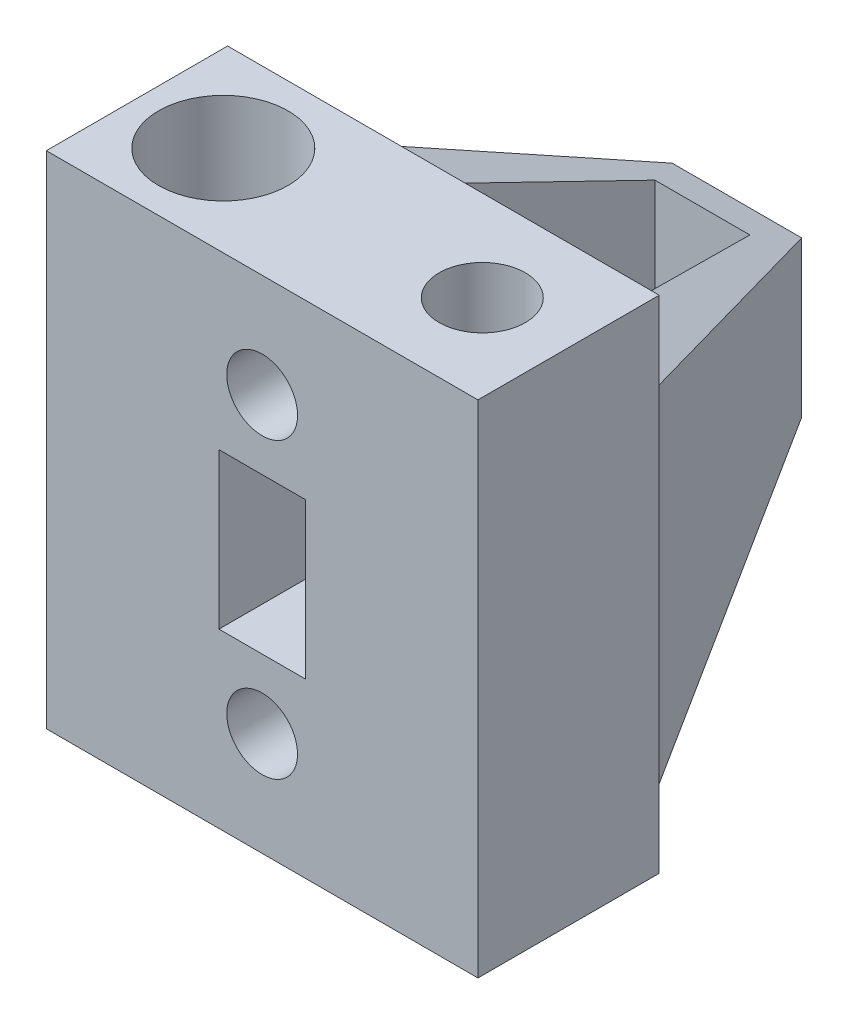
ISO-10303-21;
HEADER;
FILE_DESCRIPTION(('STEP AP214'),'2;1');
FILE_NAME('part.step','',(''),(''),'','','');
FILE_SCHEMA(('AUTOMOTIVE_DESIGN { 1 0 10303 214 1 1 1 1 }'));
ENDSEC;
DATA;
#1=APPLICATION_CONTEXT('core data for automotive mechanical design processes');
#2=APPLICATION_PROTOCOL_DEFINITION('international standard','automotive_design',2000,#1);
#3=PRODUCT_CONTEXT('',#1,'mechanical');
#4=PRODUCT('Part','Part','',(#3));
#5=PRODUCT_RELATED_PRODUCT_CATEGORY('part','',(#4));
#6=PRODUCT_DEFINITION_FORMATION('','',#4);
#7=PRODUCT_DEFINITION_CONTEXT('part definition',#1,'design');
#8=PRODUCT_DEFINITION('design','',#6,#7);
#9=PRODUCT_DEFINITION_SHAPE('','',#8);
#10=(LENGTH_UNIT() NAMED_UNIT(*) SI_UNIT(.MILLI.,.METRE.));
#11=(NAMED_UNIT(*) PLANE_ANGLE_UNIT() SI_UNIT($,.RADIAN.));
#12=(NAMED_UNIT(*) SI_UNIT($,.STERADIAN.) SOLID_ANGLE_UNIT());
#13=UNCERTAINTY_MEASURE_WITH_UNIT(LENGTH_MEASURE(1.E-05),#10,'distance_accuracy_value','');
#14=(GEOMETRIC_REPRESENTATION_CONTEXT(3) GLOBAL_UNCERTAINTY_ASSIGNED_CONTEXT((#13)) GLOBAL_UNIT_ASSIGNED_CONTEXT((#10,
#11,#12)) REPRESENTATION_CONTEXT('',''));
#15=CARTESIAN_POINT('',(0.,0.,0.));
#16=DIRECTION('',(0.,0.,1.));
#17=DIRECTION('',(1.,0.,0.));
#18=AXIS2_PLACEMENT_3D('',#15,#16,#17);
#19=CARTESIAN_POINT('',(25.,58.,-10.5));
#20=DIRECTION('',(-1.,0.,0.));
#21=DIRECTION('',(0.,0.,1.));
#22=AXIS2_PLACEMENT_3D('',#19,#20,#21);
#23=PLANE('',#22);
#24=DIRECTION('',(0.,0.,-1.));
#25=VECTOR('',#24,1.);
#26=CARTESIAN_POINT('',(25.,0.,-10.5));
#27=LINE('',#26,#25);
#28=CARTESIAN_POINT('',(25.,0.,10.5));
#29=VERTEX_POINT('',#28);
#30=CARTESIAN_POINT('',(25.,0.,-10.5));
#31=VERTEX_POINT('',#30);
#32=EDGE_CURVE('E231',#29,#31,#27,.T.);
#33=ORIENTED_EDGE('',*,*,#32,.T.);
#34=DIRECTION('',(0.,-1.,0.));
#35=VECTOR('',#34,1.);
#36=CARTESIAN_POINT('',(25.,58.,-10.5));
#37=LINE('',#36,#35);
#38=CARTESIAN_POINT('',(25.,9.00000000000001,-10.5));
#39=VERTEX_POINT('',#38);
#40=EDGE_CURVE('E40',#39,#31,#37,.T.);
#41=ORIENTED_EDGE('',*,*,#40,.F.);
#42=DIRECTION('',(0.,-1.,0.));
#43=VECTOR('',#42,1.);
#44=CARTESIAN_POINT('',(25.,49.,-10.5));
#45=LINE('',#44,#43);
#46=CARTESIAN_POINT('',(25.,49.,-10.5));
#47=VERTEX_POINT('',#46);
#48=EDGE_CURVE('E164',#47,#39,#45,.T.);
#49=ORIENTED_EDGE('',*,*,#48,.F.);
#50=CARTESIAN_POINT('',(25.,58.,-10.5));
#51=VERTEX_POINT('',#50);
#52=EDGE_CURVE('E11',#51,#47,#37,.T.);
#53=ORIENTED_EDGE('',*,*,#52,.F.);
#54=DIRECTION('',(0.,0.,-1.));
#55=VECTOR('',#54,1.);
#56=CARTESIAN_POINT('',(25.,58.,-10.5));
#57=LINE('',#56,#55);
#58=CARTESIAN_POINT('',(25.,58.,10.5));
#59=VERTEX_POINT('',#58);
#60=EDGE_CURVE('E234',#59,#51,#57,.T.);
#61=ORIENTED_EDGE('',*,*,#60,.F.);
#62=DIRECTION('',(0.,-1.,0.));
#63=VECTOR('',#62,1.);
#64=CARTESIAN_POINT('',(25.,58.,10.5));
#65=LINE('',#64,#63);
#66=EDGE_CURVE('E244',#59,#29,#65,.T.);
#67=ORIENTED_EDGE('',*,*,#66,.T.);
#68=EDGE_LOOP('',(#33,#41,#49,#53,#61,#67));
#69=FACE_BOUND('',#68,.T.);
#70=ADVANCED_FACE('F33',(#69),#23,.F.);
#71=CARTESIAN_POINT('',(-25.,58.,-10.5));
#72=DIRECTION('',(0.,0.,1.));
#73=DIRECTION('',(1.,0.,0.));
#74=AXIS2_PLACEMENT_3D('',#71,#72,#73);
#75=PLANE('',#74);
#76=DIRECTION('',(-1.,0.,0.));
#77=VECTOR('',#76,1.);
#78=CARTESIAN_POINT('',(-5.,20.,-10.5));
#79=LINE('',#78,#77);
#80=CARTESIAN_POINT('',(5.,20.,-10.5));
#81=VERTEX_POINT('',#80);
#82=CARTESIAN_POINT('',(-5.,20.,-10.5));
#83=VERTEX_POINT('',#82);
#84=EDGE_CURVE('E180',#81,#83,#79,.T.);
#85=ORIENTED_EDGE('',*,*,#84,.F.);
#86=DIRECTION('',(0.,-1.,0.));
#87=VECTOR('',#86,1.);
#88=CARTESIAN_POINT('',(5.,20.,-10.5));
#89=LINE('',#88,#87);
#90=CARTESIAN_POINT('',(5.,38.,-10.5));
#91=VERTEX_POINT('',#90);
#92=EDGE_CURVE('E183',#91,#81,#89,.T.);
#93=ORIENTED_EDGE('',*,*,#92,.F.);
#94=DIRECTION('',(1.,0.,0.));
#95=VECTOR('',#94,1.);
#96=CARTESIAN_POINT('',(-5.,38.,-10.5));
#97=LINE('',#96,#95);
#98=CARTESIAN_POINT('',(-5.,38.,-10.5));
#99=VERTEX_POINT('',#98);
#100=EDGE_CURVE('E200',#99,#91,#97,.T.);
#101=ORIENTED_EDGE('',*,*,#100,.F.);
#102=DIRECTION('',(0.,1.,0.));
#103=VECTOR('',#102,1.);
#104=CARTESIAN_POINT('',(-5.,20.,-10.5));
#105=LINE('',#104,#103);
#106=EDGE_CURVE('E178',#83,#99,#105,.T.);
#107=ORIENTED_EDGE('',*,*,#106,.F.);
#108=EDGE_LOOP('',(#85,#93,#101,#107));
#109=FACE_BOUND('',#108,.T.);
#110=DIRECTION('',(0.,-1.,0.));
#111=VECTOR('',#110,1.);
#112=CARTESIAN_POINT('',(15.,49.,-10.5));
#113=LINE('',#112,#111);
#114=CARTESIAN_POINT('',(15.,49.,-10.5));
#115=VERTEX_POINT('',#114);
#116=CARTESIAN_POINT('',(15.,9.00000000000001,-10.5));
#117=VERTEX_POINT('',#116);
#118=EDGE_CURVE('E157',#115,#117,#113,.T.);
#119=ORIENTED_EDGE('',*,*,#118,.T.);
#120=DIRECTION('',(1.,0.,0.));
#121=VECTOR('',#120,1.);
#122=CARTESIAN_POINT('',(25.,9.00000000000001,-10.5));
#123=LINE('',#122,#121);
#124=EDGE_CURVE('E142',#117,#39,#123,.T.);
#125=ORIENTED_EDGE('',*,*,#124,.T.);
#126=ORIENTED_EDGE('',*,*,#40,.T.);
#127=DIRECTION('',(-1.,0.,0.));
#128=VECTOR('',#127,1.);
#129=CARTESIAN_POINT('',(-25.,0.,-10.5));
#130=LINE('',#129,#128);
#131=CARTESIAN_POINT('',(-25.,0.,-10.5));
#132=VERTEX_POINT('',#131);
#133=EDGE_CURVE('E247',#31,#132,#130,.T.);
#134=ORIENTED_EDGE('',*,*,#133,.T.);
#135=DIRECTION('',(0.,-1.,0.));
#136=VECTOR('',#135,1.);
#137=CARTESIAN_POINT('',(-25.,58.,-10.5));
#138=LINE('',#137,#136);
#139=CARTESIAN_POINT('',(-25.,9.00000000000001,-10.5));
#140=VERTEX_POINT('',#139);
#141=EDGE_CURVE('E257',#140,#132,#138,.T.);
#142=ORIENTED_EDGE('',*,*,#141,.F.);
#143=DIRECTION('',(1.,0.,0.));
#144=VECTOR('',#143,1.);
#145=CARTESIAN_POINT('',(-25.,9.00000000000001,-10.5));
#146=LINE('',#145,#144);
#147=CARTESIAN_POINT('',(-15.,9.00000000000001,-10.5));
#148=VERTEX_POINT('',#147);
#149=EDGE_CURVE('E151',#140,#148,#146,.T.);
#150=ORIENTED_EDGE('',*,*,#149,.T.);
#151=DIRECTION('',(0.,-1.,0.));
#152=VECTOR('',#151,1.);
#153=CARTESIAN_POINT('',(-15.,49.,-10.5));
#154=LINE('',#153,#152);
#155=CARTESIAN_POINT('',(-15.,49.,-10.5));
#156=VERTEX_POINT('',#155);
#157=EDGE_CURVE('E175',#156,#148,#154,.T.);
#158=ORIENTED_EDGE('',*,*,#157,.F.);
#159=DIRECTION('',(1.,0.,0.));
#160=VECTOR('',#159,1.);
#161=CARTESIAN_POINT('',(-25.,49.,-10.5));
#162=LINE('',#161,#160);
#163=CARTESIAN_POINT('',(-25.,49.,-10.5));
#164=VERTEX_POINT('',#163);
#165=EDGE_CURVE('E150',#164,#156,#162,.T.);
#166=ORIENTED_EDGE('',*,*,#165,.F.);
#167=CARTESIAN_POINT('',(-25.,58.,-10.5));
#168=VERTEX_POINT('',#167);
#169=EDGE_CURVE('E258',#168,#164,#138,.T.);
#170=ORIENTED_EDGE('',*,*,#169,.F.);
#171=DIRECTION('',(-1.,0.,0.));
#172=VECTOR('',#171,1.);
#173=CARTESIAN_POINT('',(-25.,58.,-10.5));
#174=LINE('',#173,#172);
#175=EDGE_CURVE('E237',#51,#168,#174,.T.);
#176=ORIENTED_EDGE('',*,*,#175,.F.);
#177=ORIENTED_EDGE('',*,*,#52,.T.);
#178=DIRECTION('',(1.,0.,0.));
#179=VECTOR('',#178,1.);
#180=CARTESIAN_POINT('',(25.,49.,-10.5));
#181=LINE('',#180,#179);
#182=EDGE_CURVE('E163',#115,#47,#181,.T.);
#183=ORIENTED_EDGE('',*,*,#182,.F.);
#184=EDGE_LOOP('',(#119,#125,#126,#134,#142,#150,#158,#166,#170,#176,#177,#183));
#185=FACE_BOUND('',#184,.T.);
#186=ADVANCED_FACE('F162',(#109,#185),#75,.F.);
#187=CARTESIAN_POINT('',(-25.,58.,-10.5));
#188=DIRECTION('',(1.,0.,0.));
#189=DIRECTION('',(0.,0.,-1.));
#190=AXIS2_PLACEMENT_3D('',#187,#188,#189);
#191=PLANE('',#190);
#192=DIRECTION('',(0.,0.,1.));
#193=VECTOR('',#192,1.);
#194=CARTESIAN_POINT('',(-25.,0.,-10.5));
#195=LINE('',#194,#193);
#196=CARTESIAN_POINT('',(-25.,0.,10.5));
#197=VERTEX_POINT('',#196);
#198=EDGE_CURVE('E250',#132,#197,#195,.T.);
#199=ORIENTED_EDGE('',*,*,#198,.T.);
#200=DIRECTION('',(0.,-1.,0.));
#201=VECTOR('',#200,1.);
#202=CARTESIAN_POINT('',(-25.,58.,10.5));
#203=LINE('',#202,#201);
#204=CARTESIAN_POINT('',(-25.,58.,10.5));
#205=VERTEX_POINT('',#204);
#206=EDGE_CURVE('E255',#205,#197,#203,.T.);
#207=ORIENTED_EDGE('',*,*,#206,.F.);
#208=DIRECTION('',(0.,0.,1.));
#209=VECTOR('',#208,1.);
#210=CARTESIAN_POINT('',(-25.,58.,-10.5));
#211=LINE('',#210,#209);
#212=EDGE_CURVE('E240',#168,#205,#211,.T.);
#213=ORIENTED_EDGE('',*,*,#212,.F.);
#214=ORIENTED_EDGE('',*,*,#169,.T.);
#215=DIRECTION('',(0.,-1.,0.));
#216=VECTOR('',#215,1.);
#217=CARTESIAN_POINT('',(-25.,49.,-10.5));
#218=LINE('',#217,#216);
#219=EDGE_CURVE('E269',#164,#140,#218,.T.);
#220=ORIENTED_EDGE('',*,*,#219,.T.);
#221=ORIENTED_EDGE('',*,*,#141,.T.);
#222=EDGE_LOOP('',(#199,#207,#213,#214,#220,#221));
#223=FACE_BOUND('',#222,.T.);
#224=ADVANCED_FACE('F265',(#223),#191,.F.);
#225=CARTESIAN_POINT('',(-25.,58.,10.5));
#226=DIRECTION('',(0.,0.,-1.));
#227=DIRECTION('',(-1.,0.,0.));
#228=AXIS2_PLACEMENT_3D('',#225,#226,#227);
#229=PLANE('',#228);
#230=CARTESIAN_POINT('',(0.,46.,10.5));
#231=DIRECTION('',(0.,0.,1.));
#232=DIRECTION('',(1.,0.,0.));
#233=AXIS2_PLACEMENT_3D('',#230,#231,#232);
#234=CIRCLE('',#233,4.1);
#235=CARTESIAN_POINT('',(4.1,46.,10.5));
#236=VERTEX_POINT('',#235);
#237=EDGE_CURVE('E351',#236,#236,#234,.T.);
#238=ORIENTED_EDGE('',*,*,#237,.F.);
#239=EDGE_LOOP('',(#238));
#240=FACE_BOUND('',#239,.T.);
#241=CARTESIAN_POINT('',(0.,12.,10.5));
#242=DIRECTION('',(0.,0.,1.));
#243=DIRECTION('',(-1.,0.,0.));
#244=AXIS2_PLACEMENT_3D('',#241,#242,#243);
#245=CIRCLE('',#244,4.1);
#246=CARTESIAN_POINT('',(-4.1,12.,10.5));
#247=VERTEX_POINT('',#246);
#248=EDGE_CURVE('E345',#247,#247,#245,.T.);
#249=ORIENTED_EDGE('',*,*,#248,.F.);
#250=EDGE_LOOP('',(#249));
#251=FACE_BOUND('',#250,.T.);
#252=DIRECTION('',(-1.,0.,0.));
#253=VECTOR('',#252,1.);
#254=CARTESIAN_POINT('',(-5.,38.,10.5));
#255=LINE('',#254,#253);
#256=CARTESIAN_POINT('',(5.,38.,10.5));
#257=VERTEX_POINT('',#256);
#258=CARTESIAN_POINT('',(-5.,38.,10.5));
#259=VERTEX_POINT('',#258);
#260=EDGE_CURVE('E188',#257,#259,#255,.T.);
#261=ORIENTED_EDGE('',*,*,#260,.F.);
#262=DIRECTION('',(0.,1.,0.));
#263=VECTOR('',#262,1.);
#264=CARTESIAN_POINT('',(5.,20.,10.5));
#265=LINE('',#264,#263);
#266=CARTESIAN_POINT('',(5.,20.,10.5));
#267=VERTEX_POINT('',#266);
#268=EDGE_CURVE('E186',#267,#257,#265,.T.);
#269=ORIENTED_EDGE('',*,*,#268,.F.);
#270=DIRECTION('',(1.,0.,0.));
#271=VECTOR('',#270,1.);
#272=CARTESIAN_POINT('',(-5.,20.,10.5));
#273=LINE('',#272,#271);
#274=CARTESIAN_POINT('',(-5.,20.,10.5));
#275=VERTEX_POINT('',#274);
#276=EDGE_CURVE('E194',#275,#267,#273,.T.);
#277=ORIENTED_EDGE('',*,*,#276,.F.);
#278=DIRECTION('',(0.,-1.,0.));
#279=VECTOR('',#278,1.);
#280=CARTESIAN_POINT('',(-5.,20.,10.5));
#281=LINE('',#280,#279);
#282=EDGE_CURVE('E191',#259,#275,#281,.T.);
#283=ORIENTED_EDGE('',*,*,#282,.F.);
#284=EDGE_LOOP('',(#261,#269,#277,#283));
#285=FACE_BOUND('',#284,.T.);
#286=DIRECTION('',(1.,0.,0.));
#287=VECTOR('',#286,1.);
#288=CARTESIAN_POINT('',(-25.,0.,10.5));
#289=LINE('',#288,#287);
#290=EDGE_CURVE('E238',#197,#29,#289,.T.);
#291=ORIENTED_EDGE('',*,*,#290,.T.);
#292=ORIENTED_EDGE('',*,*,#66,.F.);
#293=DIRECTION('',(1.,0.,0.));
#294=VECTOR('',#293,1.);
#295=CARTESIAN_POINT('',(-25.,58.,10.5));
#296=LINE('',#295,#294);
#297=EDGE_CURVE('E242',#205,#59,#296,.T.);
#298=ORIENTED_EDGE('',*,*,#297,.F.);
#299=ORIENTED_EDGE('',*,*,#206,.T.);
#300=EDGE_LOOP('',(#291,#292,#298,#299));
#301=FACE_BOUND('',#300,.T.);
#302=ADVANCED_FACE('F278',(#240,#251,#285,#301),#229,.F.);
#303=CARTESIAN_POINT('',(0.,58.,0.));
#304=DIRECTION('',(0.,1.,0.));
#305=DIRECTION('',(0.,0.,1.));
#306=AXIS2_PLACEMENT_3D('',#303,#304,#305);
#307=PLANE('',#306);
#308=CARTESIAN_POINT('',(15.,58.,0.));
#309=DIRECTION('',(0.,1.,0.));
#310=DIRECTION('',(0.,0.,1.));
#311=AXIS2_PLACEMENT_3D('',#308,#309,#310);
#312=CIRCLE('',#311,5.);
#313=CARTESIAN_POINT('',(15.,58.,5.));
#314=VERTEX_POINT('',#313);
#315=EDGE_CURVE('E219',#314,#314,#312,.T.);
#316=ORIENTED_EDGE('',*,*,#315,.F.);
#317=EDGE_LOOP('',(#316));
#318=FACE_BOUND('',#317,.T.);
#319=CARTESIAN_POINT('',(-15.,58.,0.));
#320=DIRECTION('',(0.,1.,0.));
#321=DIRECTION('',(0.,0.,1.));
#322=AXIS2_PLACEMENT_3D('',#319,#320,#321);
#323=CIRCLE('',#322,7.5);
#324=CARTESIAN_POINT('',(-15.,58.,7.5));
#325=VERTEX_POINT('',#324);
#326=EDGE_CURVE('E227',#325,#325,#323,.T.);
#327=ORIENTED_EDGE('',*,*,#326,.F.);
#328=EDGE_LOOP('',(#327));
#329=FACE_BOUND('',#328,.T.);
#330=ORIENTED_EDGE('',*,*,#60,.T.);
#331=ORIENTED_EDGE('',*,*,#175,.T.);
#332=ORIENTED_EDGE('',*,*,#212,.T.);
#333=ORIENTED_EDGE('',*,*,#297,.T.);
#334=EDGE_LOOP('',(#330,#331,#332,#333));
#335=FACE_BOUND('',#334,.T.);
#336=ADVANCED_FACE('F285',(#318,#329,#335),#307,.T.);
#337=CARTESIAN_POINT('',(0.,0.,0.));
#338=DIRECTION('',(0.,1.,0.));
#339=DIRECTION('',(0.,0.,1.));
#340=AXIS2_PLACEMENT_3D('',#337,#338,#339);
#341=PLANE('',#340);
#342=CARTESIAN_POINT('',(-15.,0.,0.));
#343=DIRECTION('',(0.,-1.,0.));
#344=DIRECTION('',(0.,0.,-1.));
#345=AXIS2_PLACEMENT_3D('',#342,#343,#344);
#346=CIRCLE('',#345,7.5);
#347=CARTESIAN_POINT('',(-15.,0.,-7.5));
#348=VERTEX_POINT('',#347);
#349=EDGE_CURVE('E215',#348,#348,#346,.T.);
#350=ORIENTED_EDGE('',*,*,#349,.F.);
#351=EDGE_LOOP('',(#350));
#352=FACE_BOUND('',#351,.T.);
#353=CARTESIAN_POINT('',(15.,0.,0.));
#354=DIRECTION('',(0.,1.,0.));
#355=DIRECTION('',(0.,0.,1.));
#356=AXIS2_PLACEMENT_3D('',#353,#354,#355);
#357=CIRCLE('',#356,5.);
#358=CARTESIAN_POINT('',(15.,0.,5.));
#359=VERTEX_POINT('',#358);
#360=EDGE_CURVE('E224',#359,#359,#357,.F.);
#361=ORIENTED_EDGE('',*,*,#360,.F.);
#362=EDGE_LOOP('',(#361));
#363=FACE_BOUND('',#362,.T.);
#364=ORIENTED_EDGE('',*,*,#32,.F.);
#365=ORIENTED_EDGE('',*,*,#290,.F.);
#366=ORIENTED_EDGE('',*,*,#198,.F.);
#367=ORIENTED_EDGE('',*,*,#133,.F.);
#368=EDGE_LOOP('',(#364,#365,#366,#367));
#369=FACE_BOUND('',#368,.T.);
#370=ADVANCED_FACE('F275',(#352,#363,#369),#341,.F.);
#371=CARTESIAN_POINT('',(-15.,34.,0.));
#372=DIRECTION('',(0.,1.,0.));
#373=DIRECTION('',(0.,0.,1.));
#374=AXIS2_PLACEMENT_3D('',#371,#372,#373);
#375=CYLINDRICAL_SURFACE('',#374,7.5);
#376=CARTESIAN_POINT('',(-15.,34.,0.));
#377=DIRECTION('',(0.,1.,0.));
#378=DIRECTION('',(0.,0.,1.));
#379=AXIS2_PLACEMENT_3D('',#376,#377,#378);
#380=CIRCLE('',#379,7.5);
#381=CARTESIAN_POINT('',(-15.,34.,7.5));
#382=VERTEX_POINT('',#381);
#383=EDGE_CURVE('E228',#382,#382,#380,.T.);
#384=ORIENTED_EDGE('',*,*,#383,.F.);
#385=EDGE_LOOP('',(#384));
#386=FACE_BOUND('',#385,.T.);
#387=ORIENTED_EDGE('',*,*,#326,.T.);
#388=EDGE_LOOP('',(#387));
#389=FACE_BOUND('',#388,.T.);
#390=ADVANCED_FACE('F398',(#386,#389),#375,.F.);
#391=CARTESIAN_POINT('',(-15.,34.,0.));
#392=DIRECTION('',(0.,1.,0.));
#393=DIRECTION('',(0.,0.,1.));
#394=AXIS2_PLACEMENT_3D('',#391,#392,#393);
#395=PLANE('',#394);
#396=CARTESIAN_POINT('',(-15.,34.,0.));
#397=DIRECTION('',(0.,1.,0.));
#398=DIRECTION('',(0.,0.,1.));
#399=AXIS2_PLACEMENT_3D('',#396,#397,#398);
#400=CIRCLE('',#399,4.5);
#401=CARTESIAN_POINT('',(-15.,34.,4.5));
#402=VERTEX_POINT('',#401);
#403=EDGE_CURVE('E212',#402,#402,#400,.F.);
#404=ORIENTED_EDGE('',*,*,#403,.T.);
#405=EDGE_LOOP('',(#404));
#406=FACE_BOUND('',#405,.T.);
#407=ORIENTED_EDGE('',*,*,#383,.T.);
#408=EDGE_LOOP('',(#407));
#409=FACE_BOUND('',#408,.T.);
#410=ADVANCED_FACE('F405',(#406,#409),#395,.T.);
#411=CARTESIAN_POINT('',(15.,-0.001000000000001,0.));
#412=DIRECTION('',(0.,1.,0.));
#413=DIRECTION('',(0.,0.,1.));
#414=AXIS2_PLACEMENT_3D('',#411,#412,#413);
#415=CYLINDRICAL_SURFACE('',#414,5.);
#416=ORIENTED_EDGE('',*,*,#315,.T.);
#417=EDGE_LOOP('',(#416));
#418=FACE_BOUND('',#417,.T.);
#419=ORIENTED_EDGE('',*,*,#360,.T.);
#420=EDGE_LOOP('',(#419));
#421=FACE_BOUND('',#420,.T.);
#422=ADVANCED_FACE('F409',(#418,#421),#415,.F.);
#423=CARTESIAN_POINT('',(-15.,24.,0.));
#424=DIRECTION('',(0.,-1.,0.));
#425=DIRECTION('',(0.,0.,-1.));
#426=AXIS2_PLACEMENT_3D('',#423,#424,#425);
#427=CYLINDRICAL_SURFACE('',#426,7.5);
#428=CARTESIAN_POINT('',(-15.,24.,0.));
#429=DIRECTION('',(0.,-1.,0.));
#430=DIRECTION('',(0.,0.,-1.));
#431=AXIS2_PLACEMENT_3D('',#428,#429,#430);
#432=CIRCLE('',#431,7.5);
#433=CARTESIAN_POINT('',(-15.,24.,-7.5));
#434=VERTEX_POINT('',#433);
#435=EDGE_CURVE('E216',#434,#434,#432,.T.);
#436=ORIENTED_EDGE('',*,*,#435,.F.);
#437=EDGE_LOOP('',(#436));
#438=FACE_BOUND('',#437,.T.);
#439=ORIENTED_EDGE('',*,*,#349,.T.);
#440=EDGE_LOOP('',(#439));
#441=FACE_BOUND('',#440,.T.);
#442=ADVANCED_FACE('F413',(#438,#441),#427,.F.);
#443=CARTESIAN_POINT('',(-15.,24.,0.));
#444=DIRECTION('',(0.,-1.,0.));
#445=DIRECTION('',(0.,0.,-1.));
#446=AXIS2_PLACEMENT_3D('',#443,#444,#445);
#447=PLANE('',#446);
#448=CARTESIAN_POINT('',(-15.,24.,0.));
#449=DIRECTION('',(0.,-1.,0.));
#450=DIRECTION('',(0.,0.,-1.));
#451=AXIS2_PLACEMENT_3D('',#448,#449,#450);
#452=CIRCLE('',#451,4.5);
#453=CARTESIAN_POINT('',(-15.,24.,-4.5));
#454=VERTEX_POINT('',#453);
#455=EDGE_CURVE('E209',#454,#454,#452,.F.);
#456=ORIENTED_EDGE('',*,*,#455,.T.);
#457=EDGE_LOOP('',(#456));
#458=FACE_BOUND('',#457,.T.);
#459=ORIENTED_EDGE('',*,*,#435,.T.);
#460=EDGE_LOOP('',(#459));
#461=FACE_BOUND('',#460,.T.);
#462=ADVANCED_FACE('F417',(#458,#461),#447,.T.);
#463=CARTESIAN_POINT('',(-15.,58.001,0.));
#464=DIRECTION('',(0.,-1.,0.));
#465=DIRECTION('',(0.,0.,-1.));
#466=AXIS2_PLACEMENT_3D('',#463,#464,#465);
#467=CYLINDRICAL_SURFACE('',#466,4.5);
#468=ORIENTED_EDGE('',*,*,#403,.F.);
#469=EDGE_LOOP('',(#468));
#470=FACE_BOUND('',#469,.T.);
#471=ORIENTED_EDGE('',*,*,#455,.F.);
#472=EDGE_LOOP('',(#471));
#473=FACE_BOUND('',#472,.T.);
#474=ADVANCED_FACE('F421',(#470,#473),#467,.F.);
#475=CARTESIAN_POINT('',(5.,20.,-10.501));
#476=DIRECTION('',(1.,0.,0.));
#477=DIRECTION('',(0.,0.,-1.));
#478=AXIS2_PLACEMENT_3D('',#475,#476,#477);
#479=PLANE('',#478);
#480=ORIENTED_EDGE('',*,*,#92,.T.);
#481=DIRECTION('',(0.,0.,1.));
#482=VECTOR('',#481,1.);
#483=CARTESIAN_POINT('',(5.,20.,-10.501));
#484=LINE('',#483,#482);
#485=EDGE_CURVE('E198',#81,#267,#484,.T.);
#486=ORIENTED_EDGE('',*,*,#485,.T.);
#487=ORIENTED_EDGE('',*,*,#268,.T.);
#488=DIRECTION('',(0.,0.,1.));
#489=VECTOR('',#488,1.);
#490=CARTESIAN_POINT('',(5.,38.,-10.501));
#491=LINE('',#490,#489);
#492=EDGE_CURVE('E197',#91,#257,#491,.T.);
#493=ORIENTED_EDGE('',*,*,#492,.F.);
#494=EDGE_LOOP('',(#480,#486,#487,#493));
#495=FACE_BOUND('',#494,.T.);
#496=ADVANCED_FACE('F381',(#495),#479,.F.);
#497=CARTESIAN_POINT('',(-5.,20.,-10.501));
#498=DIRECTION('',(0.,-1.,0.));
#499=DIRECTION('',(0.,0.,-1.));
#500=AXIS2_PLACEMENT_3D('',#497,#498,#499);
#501=PLANE('',#500);
#502=ORIENTED_EDGE('',*,*,#84,.T.);
#503=DIRECTION('',(0.,0.,1.));
#504=VECTOR('',#503,1.);
#505=CARTESIAN_POINT('',(-5.,20.,-10.501));
#506=LINE('',#505,#504);
#507=EDGE_CURVE('E201',#83,#275,#506,.T.);
#508=ORIENTED_EDGE('',*,*,#507,.T.);
#509=ORIENTED_EDGE('',*,*,#276,.T.);
#510=ORIENTED_EDGE('',*,*,#485,.F.);
#511=EDGE_LOOP('',(#502,#508,#509,#510));
#512=FACE_BOUND('',#511,.T.);
#513=ADVANCED_FACE('F384',(#512),#501,.F.);
#514=CARTESIAN_POINT('',(-5.,20.,-10.501));
#515=DIRECTION('',(-1.,0.,0.));
#516=DIRECTION('',(0.,0.,1.));
#517=AXIS2_PLACEMENT_3D('',#514,#515,#516);
#518=PLANE('',#517);
#519=ORIENTED_EDGE('',*,*,#106,.T.);
#520=DIRECTION('',(0.,0.,1.));
#521=VECTOR('',#520,1.);
#522=CARTESIAN_POINT('',(-5.,38.,-10.501));
#523=LINE('',#522,#521);
#524=EDGE_CURVE('E203',#99,#259,#523,.T.);
#525=ORIENTED_EDGE('',*,*,#524,.T.);
#526=ORIENTED_EDGE('',*,*,#282,.T.);
#527=ORIENTED_EDGE('',*,*,#507,.F.);
#528=EDGE_LOOP('',(#519,#525,#526,#527));
#529=FACE_BOUND('',#528,.T.);
#530=ADVANCED_FACE('F387',(#529),#518,.F.);
#531=CARTESIAN_POINT('',(-5.,38.,-10.501));
#532=DIRECTION('',(0.,1.,0.));
#533=DIRECTION('',(0.,0.,1.));
#534=AXIS2_PLACEMENT_3D('',#531,#532,#533);
#535=PLANE('',#534);
#536=ORIENTED_EDGE('',*,*,#100,.T.);
#537=ORIENTED_EDGE('',*,*,#492,.T.);
#538=ORIENTED_EDGE('',*,*,#260,.T.);
#539=ORIENTED_EDGE('',*,*,#524,.F.);
#540=EDGE_LOOP('',(#536,#537,#538,#539));
#541=FACE_BOUND('',#540,.T.);
#542=ADVANCED_FACE('F377',(#541),#535,.F.);
#543=CARTESIAN_POINT('',(-15.,49.,-10.5));
#544=DIRECTION('',(-0.953342225350744,0.,-0.301891704694402));
#545=DIRECTION('',(-0.301891704694402,0.,0.953342225350744));
#546=AXIS2_PLACEMENT_3D('',#543,#544,#545);
#547=PLANE('',#546);
#548=ORIENTED_EDGE('',*,*,#157,.T.);
#549=DIRECTION('',(0.288481526404701,0.29473344802957,-0.91099429390958));
#550=VECTOR('',#549,1.);
#551=CARTESIAN_POINT('',(-11.5989938011964,12.474712215496,-21.2400195751694));
#552=LINE('',#551,#550);
#553=CARTESIAN_POINT('',(-5.5,18.7058823529412,-40.5));
#554=VERTEX_POINT('',#553);
#555=EDGE_CURVE('E319',#148,#554,#552,.T.);
#556=ORIENTED_EDGE('',*,*,#555,.T.);
#557=DIRECTION('',(0.,-1.,0.));
#558=VECTOR('',#557,1.);
#559=CARTESIAN_POINT('',(-5.5,49.,-40.5));
#560=LINE('',#559,#558);
#561=CARTESIAN_POINT('',(-5.5,39.2941176470588,-40.5));
#562=VERTEX_POINT('',#561);
#563=EDGE_CURVE('E166',#562,#554,#560,.T.);
#564=ORIENTED_EDGE('',*,*,#563,.F.);
#565=DIRECTION('',(-0.288481526404701,0.29473344802957,0.91099429390958));
#566=VECTOR('',#565,1.);
#567=CARTESIAN_POINT('',(-15.,49.,-10.5));
#568=LINE('',#567,#566);
#569=EDGE_CURVE('E292',#562,#156,#568,.T.);
#570=ORIENTED_EDGE('',*,*,#569,.T.);
#571=EDGE_LOOP('',(#548,#556,#564,#570));
#572=FACE_BOUND('',#571,.T.);
#573=ADVANCED_FACE('F331',(#572),#547,.F.);
#574=CARTESIAN_POINT('',(-5.5,49.,-40.5));
#575=DIRECTION('',(0.,0.,-1.));
#576=DIRECTION('',(-1.,0.,0.));
#577=AXIS2_PLACEMENT_3D('',#574,#575,#576);
#578=PLANE('',#577);
#579=CARTESIAN_POINT('',(0.,29.,-40.5));
#580=DIRECTION('',(0.,0.,-1.));
#581=DIRECTION('',(-1.,0.,0.));
#582=AXIS2_PLACEMENT_3D('',#579,#580,#581);
#583=CIRCLE('',#582,2.);
#584=CARTESIAN_POINT('',(-2.,29.,-40.5));
#585=VERTEX_POINT('',#584);
#586=EDGE_CURVE('E336',#585,#585,#583,.F.);
#587=ORIENTED_EDGE('',*,*,#586,.F.);
#588=EDGE_LOOP('',(#587));
#589=FACE_BOUND('',#588,.T.);
#590=ORIENTED_EDGE('',*,*,#563,.T.);
#591=DIRECTION('',(1.,0.,0.));
#592=VECTOR('',#591,1.);
#593=CARTESIAN_POINT('',(-5.5,18.7058823529412,-40.5));
#594=LINE('',#593,#592);
#595=CARTESIAN_POINT('',(5.5,18.7058823529412,-40.5));
#596=VERTEX_POINT('',#595);
#597=EDGE_CURVE('E160',#554,#596,#594,.T.);
#598=ORIENTED_EDGE('',*,*,#597,.T.);
#599=DIRECTION('',(0.,-1.,0.));
#600=VECTOR('',#599,1.);
#601=CARTESIAN_POINT('',(5.5,49.,-40.5));
#602=LINE('',#601,#600);
#603=CARTESIAN_POINT('',(5.5,39.2941176470588,-40.5));
#604=VERTEX_POINT('',#603);
#605=EDGE_CURVE('E159',#604,#596,#602,.T.);
#606=ORIENTED_EDGE('',*,*,#605,.F.);
#607=DIRECTION('',(-1.,0.,0.));
#608=VECTOR('',#607,1.);
#609=CARTESIAN_POINT('',(-5.5,39.2941176470588,-40.5));
#610=LINE('',#609,#608);
#611=EDGE_CURVE('E326',#604,#562,#610,.T.);
#612=ORIENTED_EDGE('',*,*,#611,.T.);
#613=EDGE_LOOP('',(#590,#598,#606,#612));
#614=FACE_BOUND('',#613,.T.);
#615=ADVANCED_FACE('F333',(#589,#614),#578,.F.);
#616=CARTESIAN_POINT('',(15.,49.,-10.5));
#617=DIRECTION('',(0.953342225350744,0.,-0.301891704694402));
#618=DIRECTION('',(-0.301891704694402,0.,-0.953342225350744));
#619=AXIS2_PLACEMENT_3D('',#616,#617,#618);
#620=PLANE('',#619);
#621=ORIENTED_EDGE('',*,*,#605,.T.);
#622=DIRECTION('',(0.288481526404701,-0.29473344802957,0.91099429390958));
#623=VECTOR('',#622,1.);
#624=CARTESIAN_POINT('',(11.5989938011964,12.474712215496,-21.2400195751694));
#625=LINE('',#624,#623);
#626=EDGE_CURVE('E145',#596,#117,#625,.T.);
#627=ORIENTED_EDGE('',*,*,#626,.T.);
#628=ORIENTED_EDGE('',*,*,#118,.F.);
#629=DIRECTION('',(-0.288481526404701,-0.29473344802957,-0.91099429390958));
#630=VECTOR('',#629,1.);
#631=CARTESIAN_POINT('',(15.,49.,-10.5));
#632=LINE('',#631,#630);
#633=EDGE_CURVE('E47',#115,#604,#632,.T.);
#634=ORIENTED_EDGE('',*,*,#633,.T.);
#635=EDGE_LOOP('',(#621,#627,#628,#634));
#636=FACE_BOUND('',#635,.T.);
#637=ADVANCED_FACE('F156',(#636),#620,.F.);
#638=CARTESIAN_POINT('',(7.5,49.,-44.5));
#639=DIRECTION('',(-0.889135810388049,0.,0.457643431817378));
#640=DIRECTION('',(0.457643431817378,0.,0.889135810388049));
#641=AXIS2_PLACEMENT_3D('',#638,#639,#640);
#642=PLANE('',#641);
#643=ORIENTED_EDGE('',*,*,#48,.T.);
#644=DIRECTION('',(-0.439808177757987,0.276450854590735,-0.854484459644089));
#645=VECTOR('',#644,1.);
#646=CARTESIAN_POINT('',(3.97402494868151,22.2163271751145,-51.3504658139902));
#647=LINE('',#646,#645);
#648=CARTESIAN_POINT('',(7.5,20.,-44.5));
#649=VERTEX_POINT('',#648);
#650=EDGE_CURVE('E55',#39,#649,#647,.T.);
#651=ORIENTED_EDGE('',*,*,#650,.T.);
#652=DIRECTION('',(0.,-1.,0.));
#653=VECTOR('',#652,1.);
#654=CARTESIAN_POINT('',(7.5,49.,-44.5));
#655=LINE('',#654,#653);
#656=CARTESIAN_POINT('',(7.5,38.,-44.5));
#657=VERTEX_POINT('',#656);
#658=EDGE_CURVE('E169',#657,#649,#655,.T.);
#659=ORIENTED_EDGE('',*,*,#658,.F.);
#660=DIRECTION('',(0.439808177757987,0.276450854590735,0.854484459644089));
#661=VECTOR('',#660,1.);
#662=CARTESIAN_POINT('',(8.83743881256908,38.8406758250434,-41.9015474498658));
#663=LINE('',#662,#661);
#664=EDGE_CURVE('E311',#657,#47,#663,.T.);
#665=ORIENTED_EDGE('',*,*,#664,.T.);
#666=EDGE_LOOP('',(#643,#651,#659,#665));
#667=FACE_BOUND('',#666,.T.);
#668=ADVANCED_FACE('F310',(#667),#642,.F.);
#669=CARTESIAN_POINT('',(-7.5,49.,-44.5));
#670=DIRECTION('',(0.,0.,1.));
#671=DIRECTION('',(1.,0.,0.));
#672=AXIS2_PLACEMENT_3D('',#669,#670,#671);
#673=PLANE('',#672);
#674=CARTESIAN_POINT('',(0.,29.,-44.5));
#675=DIRECTION('',(0.,0.,-1.));
#676=DIRECTION('',(-1.,0.,0.));
#677=AXIS2_PLACEMENT_3D('',#674,#675,#676);
#678=CIRCLE('',#677,2.);
#679=CARTESIAN_POINT('',(-2.,29.,-44.5));
#680=VERTEX_POINT('',#679);
#681=EDGE_CURVE('E339',#680,#680,#678,.T.);
#682=ORIENTED_EDGE('',*,*,#681,.F.);
#683=EDGE_LOOP('',(#682));
#684=FACE_BOUND('',#683,.T.);
#685=ORIENTED_EDGE('',*,*,#658,.T.);
#686=DIRECTION('',(-1.,0.,0.));
#687=VECTOR('',#686,1.);
#688=CARTESIAN_POINT('',(37.5,20.,-44.5));
#689=LINE('',#688,#687);
#690=CARTESIAN_POINT('',(-7.49999999999999,20.,-44.5));
#691=VERTEX_POINT('',#690);
#692=EDGE_CURVE('E306',#649,#691,#689,.T.);
#693=ORIENTED_EDGE('',*,*,#692,.T.);
#694=DIRECTION('',(0.,-1.,0.));
#695=VECTOR('',#694,1.);
#696=CARTESIAN_POINT('',(-7.5,49.,-44.5));
#697=LINE('',#696,#695);
#698=CARTESIAN_POINT('',(-7.5,38.,-44.5));
#699=VERTEX_POINT('',#698);
#700=EDGE_CURVE('E297',#699,#691,#697,.T.);
#701=ORIENTED_EDGE('',*,*,#700,.F.);
#702=DIRECTION('',(-1.,0.,0.));
#703=VECTOR('',#702,1.);
#704=CARTESIAN_POINT('',(37.5,38.,-44.5));
#705=LINE('',#704,#703);
#706=EDGE_CURVE('E307',#657,#699,#705,.T.);
#707=ORIENTED_EDGE('',*,*,#706,.F.);
#708=EDGE_LOOP('',(#685,#693,#701,#707));
#709=FACE_BOUND('',#708,.T.);
#710=ADVANCED_FACE('F304',(#684,#709),#673,.F.);
#711=CARTESIAN_POINT('',(-7.5,49.,-44.5));
#712=DIRECTION('',(0.889135810388049,0.,0.457643431817378));
#713=DIRECTION('',(0.457643431817378,0.,-0.889135810388049));
#714=AXIS2_PLACEMENT_3D('',#711,#712,#713);
#715=PLANE('',#714);
#716=ORIENTED_EDGE('',*,*,#700,.T.);
#717=DIRECTION('',(-0.439808177757987,-0.276450854590735,0.854484459644089));
#718=VECTOR('',#717,1.);
#719=CARTESIAN_POINT('',(-3.97402494868151,22.2163271751145,-51.3504658139902));
#720=LINE('',#719,#718);
#721=EDGE_CURVE('E312',#691,#140,#720,.T.);
#722=ORIENTED_EDGE('',*,*,#721,.T.);
#723=ORIENTED_EDGE('',*,*,#219,.F.);
#724=DIRECTION('',(0.439808177757987,-0.276450854590735,-0.854484459644089));
#725=VECTOR('',#724,1.);
#726=CARTESIAN_POINT('',(-8.83743881256908,38.8406758250434,-41.9015474498658));
#727=LINE('',#726,#725);
#728=EDGE_CURVE('E322',#164,#699,#727,.T.);
#729=ORIENTED_EDGE('',*,*,#728,.T.);
#730=EDGE_LOOP('',(#716,#722,#723,#729));
#731=FACE_BOUND('',#730,.T.);
#732=ADVANCED_FACE('F335',(#731),#715,.F.);
#733=CARTESIAN_POINT('',(37.5,20.,-44.5));
#734=DIRECTION('',(0.,0.951444518554411,0.307820285414662));
#735=DIRECTION('',(0.,-0.307820285414662,0.951444518554411));
#736=AXIS2_PLACEMENT_3D('',#733,#734,#735);
#737=PLANE('',#736);
#738=ORIENTED_EDGE('',*,*,#149,.F.);
#739=ORIENTED_EDGE('',*,*,#721,.F.);
#740=ORIENTED_EDGE('',*,*,#692,.F.);
#741=ORIENTED_EDGE('',*,*,#650,.F.);
#742=ORIENTED_EDGE('',*,*,#124,.F.);
#743=ORIENTED_EDGE('',*,*,#626,.F.);
#744=ORIENTED_EDGE('',*,*,#597,.F.);
#745=ORIENTED_EDGE('',*,*,#555,.F.);
#746=EDGE_LOOP('',(#738,#739,#740,#741,#742,#743,#744,#745));
#747=FACE_BOUND('',#746,.T.);
#748=ADVANCED_FACE('F144',(#747),#737,.F.);
#749=CARTESIAN_POINT('',(37.5,38.,-44.5));
#750=DIRECTION('',(0.,-0.951444518554411,0.307820285414662));
#751=DIRECTION('',(0.,-0.307820285414663,-0.951444518554412));
#752=AXIS2_PLACEMENT_3D('',#749,#750,#751);
#753=PLANE('',#752);
#754=ORIENTED_EDGE('',*,*,#611,.F.);
#755=ORIENTED_EDGE('',*,*,#633,.F.);
#756=ORIENTED_EDGE('',*,*,#182,.T.);
#757=ORIENTED_EDGE('',*,*,#664,.F.);
#758=ORIENTED_EDGE('',*,*,#706,.T.);
#759=ORIENTED_EDGE('',*,*,#728,.F.);
#760=ORIENTED_EDGE('',*,*,#165,.T.);
#761=ORIENTED_EDGE('',*,*,#569,.F.);
#762=EDGE_LOOP('',(#754,#755,#756,#757,#758,#759,#760,#761));
#763=FACE_BOUND('',#762,.T.);
#764=ADVANCED_FACE('F332',(#763),#753,.F.);
#765=CARTESIAN_POINT('',(0.,29.,10.501));
#766=DIRECTION('',(0.,0.,-1.));
#767=DIRECTION('',(-1.,0.,0.));
#768=AXIS2_PLACEMENT_3D('',#765,#766,#767);
#769=CYLINDRICAL_SURFACE('',#768,2.);
#770=ORIENTED_EDGE('',*,*,#681,.T.);
#771=EDGE_LOOP('',(#770));
#772=FACE_BOUND('',#771,.T.);
#773=ORIENTED_EDGE('',*,*,#586,.T.);
#774=EDGE_LOOP('',(#773));
#775=FACE_BOUND('',#774,.T.);
#776=ADVANCED_FACE('F450',(#772,#775),#769,.F.);
#777=CARTESIAN_POINT('',(0.,12.,-4.5));
#778=DIRECTION('',(0.,0.,1.));
#779=DIRECTION('',(1.,0.,0.));
#780=AXIS2_PLACEMENT_3D('',#777,#778,#779);
#781=CYLINDRICAL_SURFACE('',#780,4.1);
#782=CARTESIAN_POINT('',(0.,12.,-4.5));
#783=DIRECTION('',(0.,0.,1.));
#784=DIRECTION('',(-1.,0.,0.));
#785=AXIS2_PLACEMENT_3D('',#782,#783,#784);
#786=CIRCLE('',#785,4.1);
#787=CARTESIAN_POINT('',(-4.1,12.,-4.5));
#788=VERTEX_POINT('',#787);
#789=EDGE_CURVE('E348',#788,#788,#786,.T.);
#790=ORIENTED_EDGE('',*,*,#789,.F.);
#791=EDGE_LOOP('',(#790));
#792=FACE_BOUND('',#791,.T.);
#793=ORIENTED_EDGE('',*,*,#248,.T.);
#794=EDGE_LOOP('',(#793));
#795=FACE_BOUND('',#794,.T.);
#796=ADVANCED_FACE('F455',(#792,#795),#781,.F.);
#797=CARTESIAN_POINT('',(0.,12.,-4.5));
#798=DIRECTION('',(0.,0.,-1.));
#799=DIRECTION('',(-1.,0.,0.));
#800=AXIS2_PLACEMENT_3D('',#797,#798,#799);
#801=PLANE('',#800);
#802=ORIENTED_EDGE('',*,*,#789,.T.);
#803=EDGE_LOOP('',(#802));
#804=FACE_BOUND('',#803,.T.);
#805=ADVANCED_FACE('F362',(#804),#801,.F.);
#806=CARTESIAN_POINT('',(0.,46.,-4.5));
#807=DIRECTION('',(0.,0.,1.));
#808=DIRECTION('',(1.,0.,0.));
#809=AXIS2_PLACEMENT_3D('',#806,#807,#808);
#810=CYLINDRICAL_SURFACE('',#809,4.1);
#811=CARTESIAN_POINT('',(0.,46.,-4.5));
#812=DIRECTION('',(0.,0.,1.));
#813=DIRECTION('',(1.,0.,0.));
#814=AXIS2_PLACEMENT_3D('',#811,#812,#813);
#815=CIRCLE('',#814,4.1);
#816=CARTESIAN_POINT('',(4.1,46.,-4.5));
#817=VERTEX_POINT('',#816);
#818=EDGE_CURVE('E344',#817,#817,#815,.T.);
#819=ORIENTED_EDGE('',*,*,#818,.F.);
#820=EDGE_LOOP('',(#819));
#821=FACE_BOUND('',#820,.T.);
#822=ORIENTED_EDGE('',*,*,#237,.T.);
#823=EDGE_LOOP('',(#822));
#824=FACE_BOUND('',#823,.T.);
#825=ADVANCED_FACE('F359',(#821,#824),#810,.F.);
#826=CARTESIAN_POINT('',(0.,46.,-4.5));
#827=DIRECTION('',(0.,0.,1.));
#828=DIRECTION('',(1.,0.,0.));
#829=AXIS2_PLACEMENT_3D('',#826,#827,#828);
#830=PLANE('',#829);
#831=ORIENTED_EDGE('',*,*,#818,.T.);
#832=EDGE_LOOP('',(#831));
#833=FACE_BOUND('',#832,.T.);
#834=ADVANCED_FACE('F357',(#833),#830,.T.);
#835=CLOSED_SHELL('',(#70,#186,#224,#302,#336,#370,#390,#410,#422,#442,#462,#474,#496,#513,#530,
#542,#573,#615,#637,#668,#710,#732,#748,#764,#776,#796,#805,#825,#834));
#836=MANIFOLD_SOLID_BREP('B2',#835);
#837=ADVANCED_BREP_SHAPE_REPRESENTATION('',(#18,#836),#14);
#838=SHAPE_DEFINITION_REPRESENTATION(#9,#837);
ENDSEC;
END-ISO-10303-21;
